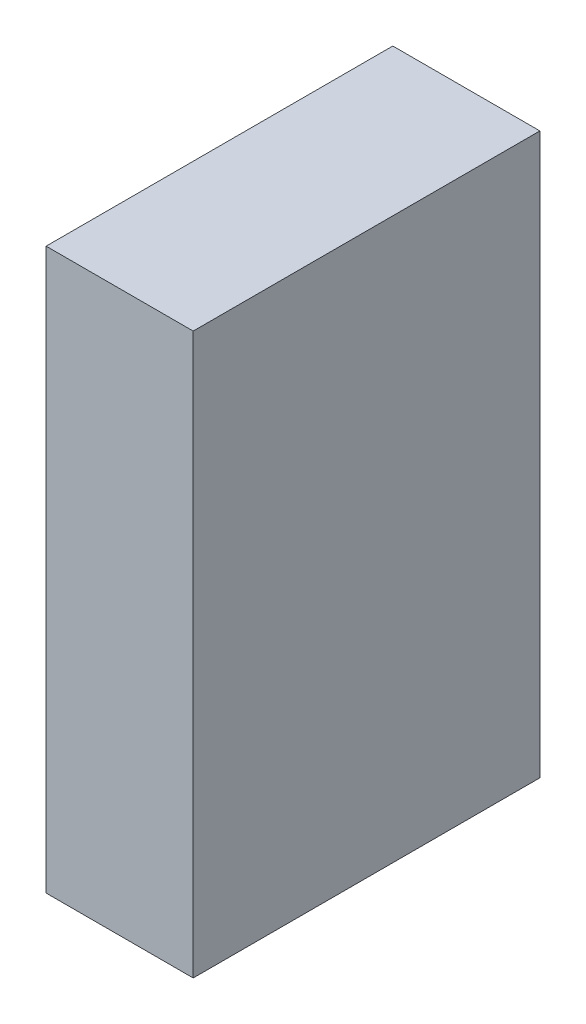
ISO-10303-21;
HEADER;
FILE_DESCRIPTION(('STEP AP214'),'2;1');
FILE_NAME('part.step','',(''),(''),'','','');
FILE_SCHEMA(('AUTOMOTIVE_DESIGN { 1 0 10303 214 1 1 1 1 }'));
ENDSEC;
DATA;
#1=APPLICATION_CONTEXT('core data for automotive mechanical design processes');
#2=APPLICATION_PROTOCOL_DEFINITION('international standard','automotive_design',2000,#1);
#3=PRODUCT_CONTEXT('',#1,'mechanical');
#4=PRODUCT('Part','Part','',(#3));
#5=PRODUCT_RELATED_PRODUCT_CATEGORY('part','',(#4));
#6=PRODUCT_DEFINITION_FORMATION('','',#4);
#7=PRODUCT_DEFINITION_CONTEXT('part definition',#1,'design');
#8=PRODUCT_DEFINITION('design','',#6,#7);
#9=PRODUCT_DEFINITION_SHAPE('','',#8);
#10=(LENGTH_UNIT() NAMED_UNIT(*) SI_UNIT(.MILLI.,.METRE.));
#11=(NAMED_UNIT(*) PLANE_ANGLE_UNIT() SI_UNIT($,.RADIAN.));
#12=(NAMED_UNIT(*) SI_UNIT($,.STERADIAN.) SOLID_ANGLE_UNIT());
#13=UNCERTAINTY_MEASURE_WITH_UNIT(LENGTH_MEASURE(1.E-05),#10,'distance_accuracy_value','');
#14=(GEOMETRIC_REPRESENTATION_CONTEXT(3) GLOBAL_UNCERTAINTY_ASSIGNED_CONTEXT((#13)) GLOBAL_UNIT_ASSIGNED_CONTEXT((#10,
#11,#12)) REPRESENTATION_CONTEXT('',''));
#15=CARTESIAN_POINT('',(0.,0.,0.));
#16=DIRECTION('',(0.,0.,1.));
#17=DIRECTION('',(1.,0.,0.));
#18=AXIS2_PLACEMENT_3D('',#15,#16,#17);
#19=CARTESIAN_POINT('',(21.,80.,99.));
#20=DIRECTION('',(-1.,0.,0.));
#21=DIRECTION('',(0.,-1.,0.));
#22=AXIS2_PLACEMENT_3D('',#19,#20,#21);
#23=PLANE('',#22);
#24=DIRECTION('',(0.,1.,0.));
#25=VECTOR('',#24,1.);
#26=CARTESIAN_POINT('',(21.,80.,0.));
#27=LINE('',#26,#25);
#28=CARTESIAN_POINT('',(21.,-80.,0.));
#29=VERTEX_POINT('',#28);
#30=CARTESIAN_POINT('',(21.,80.,0.));
#31=VERTEX_POINT('',#30);
#32=EDGE_CURVE('E96',#29,#31,#27,.T.);
#33=ORIENTED_EDGE('',*,*,#32,.T.);
#34=DIRECTION('',(0.,0.,-1.));
#35=VECTOR('',#34,1.);
#36=CARTESIAN_POINT('',(21.,80.,99.));
#37=LINE('',#36,#35);
#38=CARTESIAN_POINT('',(21.,80.,99.));
#39=VERTEX_POINT('',#38);
#40=EDGE_CURVE('E11',#39,#31,#37,.T.);
#41=ORIENTED_EDGE('',*,*,#40,.F.);
#42=DIRECTION('',(0.,1.,0.));
#43=VECTOR('',#42,1.);
#44=CARTESIAN_POINT('',(21.,80.,99.));
#45=LINE('',#44,#43);
#46=CARTESIAN_POINT('',(21.,-80.,99.));
#47=VERTEX_POINT('',#46);
#48=EDGE_CURVE('E84',#47,#39,#45,.T.);
#49=ORIENTED_EDGE('',*,*,#48,.F.);
#50=DIRECTION('',(0.,0.,-1.));
#51=VECTOR('',#50,1.);
#52=CARTESIAN_POINT('',(21.,-80.,99.));
#53=LINE('',#52,#51);
#54=EDGE_CURVE('E92',#47,#29,#53,.T.);
#55=ORIENTED_EDGE('',*,*,#54,.T.);
#56=EDGE_LOOP('',(#33,#41,#49,#55));
#57=FACE_BOUND('',#56,.T.);
#58=ADVANCED_FACE('F33',(#57),#23,.F.);
#59=CARTESIAN_POINT('',(-21.,80.,99.));
#60=DIRECTION('',(0.,-1.,0.));
#61=DIRECTION('',(0.,0.,-1.));
#62=AXIS2_PLACEMENT_3D('',#59,#60,#61);
#63=PLANE('',#62);
#64=DIRECTION('',(-1.,0.,0.));
#65=VECTOR('',#64,1.);
#66=CARTESIAN_POINT('',(-21.,80.,0.));
#67=LINE('',#66,#65);
#68=CARTESIAN_POINT('',(-21.,80.,0.));
#69=VERTEX_POINT('',#68);
#70=EDGE_CURVE('E88',#31,#69,#67,.T.);
#71=ORIENTED_EDGE('',*,*,#70,.T.);
#72=DIRECTION('',(0.,0.,-1.));
#73=VECTOR('',#72,1.);
#74=CARTESIAN_POINT('',(-21.,80.,99.));
#75=LINE('',#74,#73);
#76=CARTESIAN_POINT('',(-21.,80.,99.));
#77=VERTEX_POINT('',#76);
#78=EDGE_CURVE('E41',#77,#69,#75,.T.);
#79=ORIENTED_EDGE('',*,*,#78,.F.);
#80=DIRECTION('',(-1.,0.,0.));
#81=VECTOR('',#80,1.);
#82=CARTESIAN_POINT('',(-21.,80.,99.));
#83=LINE('',#82,#81);
#84=EDGE_CURVE('E79',#39,#77,#83,.T.);
#85=ORIENTED_EDGE('',*,*,#84,.F.);
#86=ORIENTED_EDGE('',*,*,#40,.T.);
#87=EDGE_LOOP('',(#71,#79,#85,#86));
#88=FACE_BOUND('',#87,.T.);
#89=ADVANCED_FACE('F87',(#88),#63,.F.);
#90=CARTESIAN_POINT('',(-21.,80.,99.));
#91=DIRECTION('',(1.,0.,0.));
#92=DIRECTION('',(0.,1.,0.));
#93=AXIS2_PLACEMENT_3D('',#90,#91,#92);
#94=PLANE('',#93);
#95=DIRECTION('',(0.,-1.,0.));
#96=VECTOR('',#95,1.);
#97=CARTESIAN_POINT('',(-21.,80.,0.));
#98=LINE('',#97,#96);
#99=CARTESIAN_POINT('',(-21.,-80.,0.));
#100=VERTEX_POINT('',#99);
#101=EDGE_CURVE('E66',#69,#100,#98,.T.);
#102=ORIENTED_EDGE('',*,*,#101,.T.);
#103=DIRECTION('',(0.,0.,-1.));
#104=VECTOR('',#103,1.);
#105=CARTESIAN_POINT('',(-21.,-80.,99.));
#106=LINE('',#105,#104);
#107=CARTESIAN_POINT('',(-21.,-80.,99.));
#108=VERTEX_POINT('',#107);
#109=EDGE_CURVE('E89',#108,#100,#106,.T.);
#110=ORIENTED_EDGE('',*,*,#109,.F.);
#111=DIRECTION('',(0.,-1.,0.));
#112=VECTOR('',#111,1.);
#113=CARTESIAN_POINT('',(-21.,80.,99.));
#114=LINE('',#113,#112);
#115=EDGE_CURVE('E82',#77,#108,#114,.T.);
#116=ORIENTED_EDGE('',*,*,#115,.F.);
#117=ORIENTED_EDGE('',*,*,#78,.T.);
#118=EDGE_LOOP('',(#102,#110,#116,#117));
#119=FACE_BOUND('',#118,.T.);
#120=ADVANCED_FACE('F90',(#119),#94,.F.);
#121=CARTESIAN_POINT('',(-21.,-80.,99.));
#122=DIRECTION('',(0.,1.,0.));
#123=DIRECTION('',(0.,0.,1.));
#124=AXIS2_PLACEMENT_3D('',#121,#122,#123);
#125=PLANE('',#124);
#126=DIRECTION('',(1.,0.,0.));
#127=VECTOR('',#126,1.);
#128=CARTESIAN_POINT('',(-21.,-80.,0.));
#129=LINE('',#128,#127);
#130=EDGE_CURVE('E72',#100,#29,#129,.T.);
#131=ORIENTED_EDGE('',*,*,#130,.T.);
#132=ORIENTED_EDGE('',*,*,#54,.F.);
#133=DIRECTION('',(1.,0.,0.));
#134=VECTOR('',#133,1.);
#135=CARTESIAN_POINT('',(-21.,-80.,99.));
#136=LINE('',#135,#134);
#137=EDGE_CURVE('E49',#108,#47,#136,.T.);
#138=ORIENTED_EDGE('',*,*,#137,.F.);
#139=ORIENTED_EDGE('',*,*,#109,.T.);
#140=EDGE_LOOP('',(#131,#132,#138,#139));
#141=FACE_BOUND('',#140,.T.);
#142=ADVANCED_FACE('F103',(#141),#125,.F.);
#143=CARTESIAN_POINT('',(0.,0.,99.));
#144=DIRECTION('',(0.,0.,1.));
#145=DIRECTION('',(1.,0.,0.));
#146=AXIS2_PLACEMENT_3D('',#143,#144,#145);
#147=PLANE('',#146);
#148=ORIENTED_EDGE('',*,*,#48,.T.);
#149=ORIENTED_EDGE('',*,*,#84,.T.);
#150=ORIENTED_EDGE('',*,*,#115,.T.);
#151=ORIENTED_EDGE('',*,*,#137,.T.);
#152=EDGE_LOOP('',(#148,#149,#150,#151));
#153=FACE_BOUND('',#152,.T.);
#154=ADVANCED_FACE('F80',(#153),#147,.T.);
#155=CARTESIAN_POINT('',(0.,0.,0.));
#156=DIRECTION('',(0.,0.,1.));
#157=DIRECTION('',(1.,0.,0.));
#158=AXIS2_PLACEMENT_3D('',#155,#156,#157);
#159=PLANE('',#158);
#160=ORIENTED_EDGE('',*,*,#32,.F.);
#161=ORIENTED_EDGE('',*,*,#130,.F.);
#162=ORIENTED_EDGE('',*,*,#101,.F.);
#163=ORIENTED_EDGE('',*,*,#70,.F.);
#164=EDGE_LOOP('',(#160,#161,#162,#163));
#165=FACE_BOUND('',#164,.T.);
#166=ADVANCED_FACE('F106',(#165),#159,.F.);
#167=CLOSED_SHELL('',(#58,#89,#120,#142,#154,#166));
#168=MANIFOLD_SOLID_BREP('B2',#167);
#169=ADVANCED_BREP_SHAPE_REPRESENTATION('',(#18,#168),#14);
#170=SHAPE_DEFINITION_REPRESENTATION(#9,#169);
ENDSEC;
END-ISO-10303-21;
